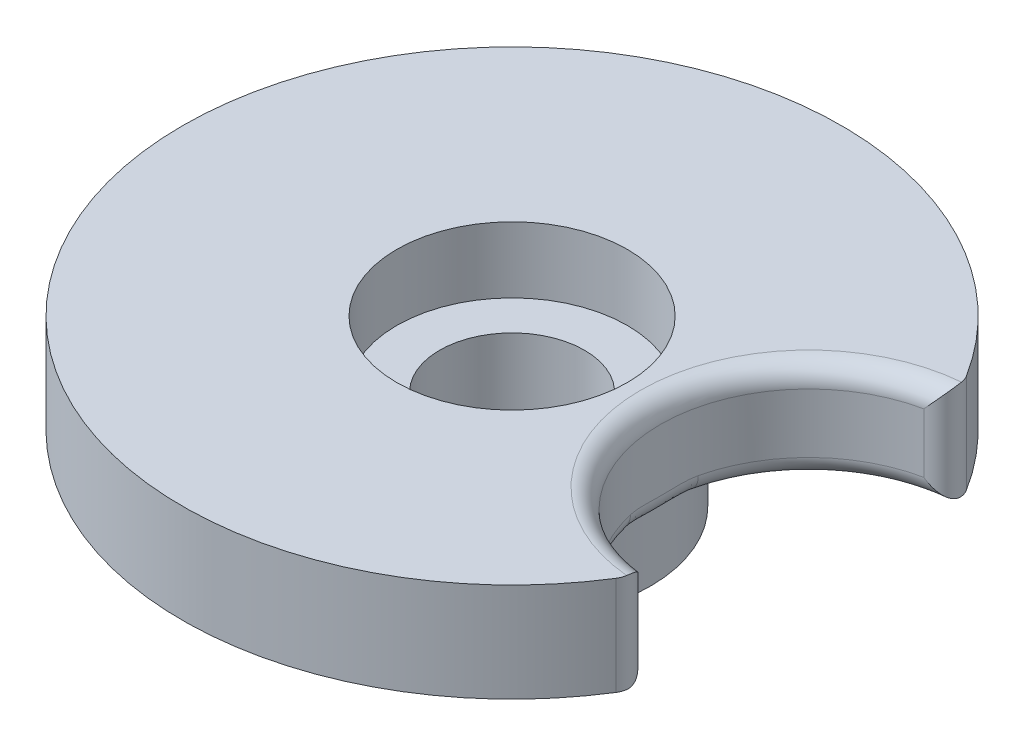
ISO-10303-21;
HEADER;
FILE_DESCRIPTION(('STEP AP214'),'2;1');
FILE_NAME('part.step','',(''),(''),'','','');
FILE_SCHEMA(('AUTOMOTIVE_DESIGN { 1 0 10303 214 1 1 1 1 }'));
ENDSEC;
DATA;
#1=APPLICATION_CONTEXT('core data for automotive mechanical design processes');
#2=APPLICATION_PROTOCOL_DEFINITION('international standard','automotive_design',2000,#1);
#3=PRODUCT_CONTEXT('',#1,'mechanical');
#4=PRODUCT('Part','Part','',(#3));
#5=PRODUCT_RELATED_PRODUCT_CATEGORY('part','',(#4));
#6=PRODUCT_DEFINITION_FORMATION('','',#4);
#7=PRODUCT_DEFINITION_CONTEXT('part definition',#1,'design');
#8=PRODUCT_DEFINITION('design','',#6,#7);
#9=PRODUCT_DEFINITION_SHAPE('','',#8);
#10=(LENGTH_UNIT() NAMED_UNIT(*) SI_UNIT(.MILLI.,.METRE.));
#11=(NAMED_UNIT(*) PLANE_ANGLE_UNIT() SI_UNIT($,.RADIAN.));
#12=(NAMED_UNIT(*) SI_UNIT($,.STERADIAN.) SOLID_ANGLE_UNIT());
#13=UNCERTAINTY_MEASURE_WITH_UNIT(LENGTH_MEASURE(1.E-05),#10,'distance_accuracy_value','');
#14=(GEOMETRIC_REPRESENTATION_CONTEXT(3) GLOBAL_UNCERTAINTY_ASSIGNED_CONTEXT((#13)) GLOBAL_UNIT_ASSIGNED_CONTEXT((#10,
#11,#12)) REPRESENTATION_CONTEXT('',''));
#15=CARTESIAN_POINT('',(0.,0.,0.));
#16=DIRECTION('',(0.,0.,1.));
#17=DIRECTION('',(1.,0.,0.));
#18=AXIS2_PLACEMENT_3D('',#15,#16,#17);
#19=CARTESIAN_POINT('',(0.,0.,0.));
#20=DIRECTION('',(0.,1.,0.));
#21=DIRECTION('',(0.,0.,1.));
#22=AXIS2_PLACEMENT_3D('',#19,#20,#21);
#23=PLANE('',#22);
#24=CARTESIAN_POINT('',(0.,0.,0.));
#25=DIRECTION('',(0.,1.,0.));
#26=DIRECTION('',(0.,0.,1.));
#27=AXIS2_PLACEMENT_3D('',#24,#25,#26);
#28=CIRCLE('',#27,5.334);
#29=CARTESIAN_POINT('',(5.12445,0.,1.48039460871081));
#30=VERTEX_POINT('',#29);
#31=CARTESIAN_POINT('',(5.12445,0.,-1.48039460871081));
#32=VERTEX_POINT('',#31);
#33=EDGE_CURVE('E143',#30,#32,#28,.F.);
#34=ORIENTED_EDGE('',*,*,#33,.F.);
#35=CARTESIAN_POINT('',(11.43,0.,0.));
#36=DIRECTION('',(0.,1.,0.));
#37=DIRECTION('',(0.,0.,1.));
#38=AXIS2_PLACEMENT_3D('',#35,#36,#37);
#39=CIRCLE('',#38,6.477);
#40=CARTESIAN_POINT('',(10.8680622925585,0.,6.45257739302331));
#41=VERTEX_POINT('',#40);
#42=EDGE_CURVE('E148',#30,#41,#39,.T.);
#43=ORIENTED_EDGE('',*,*,#42,.T.);
#44=CARTESIAN_POINT('',(10.1141388888889,0.,6.34192703649809));
#45=DIRECTION('',(0.,1.,0.));
#46=DIRECTION('',(0.,0.,1.));
#47=AXIS2_PLACEMENT_3D('',#44,#45,#46);
#48=CIRCLE('',#47,0.762);
#49=CARTESIAN_POINT('',(10.7597222222222,0.,6.74673088989158));
#50=VERTEX_POINT('',#49);
#51=EDGE_CURVE('E130',#41,#50,#48,.F.);
#52=ORIENTED_EDGE('',*,*,#51,.T.);
#53=CARTESIAN_POINT('',(0.,0.,0.));
#54=DIRECTION('',(0.,1.,0.));
#55=DIRECTION('',(0.,0.,1.));
#56=AXIS2_PLACEMENT_3D('',#53,#54,#55);
#57=CIRCLE('',#56,12.7);
#58=CARTESIAN_POINT('',(10.7597222222222,0.,-6.74673088989158));
#59=VERTEX_POINT('',#58);
#60=EDGE_CURVE('E118',#59,#50,#57,.T.);
#61=ORIENTED_EDGE('',*,*,#60,.F.);
#62=CARTESIAN_POINT('',(10.1141388888889,0.,-6.34192703649809));
#63=DIRECTION('',(0.,1.,0.));
#64=DIRECTION('',(0.,0.,1.));
#65=AXIS2_PLACEMENT_3D('',#62,#63,#64);
#66=CIRCLE('',#65,0.762);
#67=CARTESIAN_POINT('',(10.8680622925585,0.,-6.45257739302331));
#68=VERTEX_POINT('',#67);
#69=EDGE_CURVE('E127',#59,#68,#66,.F.);
#70=ORIENTED_EDGE('',*,*,#69,.T.);
#71=CARTESIAN_POINT('',(11.43,0.,0.));
#72=DIRECTION('',(0.,1.,0.));
#73=DIRECTION('',(0.,0.,1.));
#74=AXIS2_PLACEMENT_3D('',#71,#72,#73);
#75=CIRCLE('',#74,6.477);
#76=EDGE_CURVE('E138',#68,#32,#75,.T.);
#77=ORIENTED_EDGE('',*,*,#76,.T.);
#78=EDGE_LOOP('',(#34,#43,#52,#61,#70,#77));
#79=FACE_BOUND('',#78,.T.);
#80=ADVANCED_FACE('F43',(#79),#23,.F.);
#81=CARTESIAN_POINT('',(0.,3.81,0.));
#82=DIRECTION('',(0.,-1.,0.));
#83=DIRECTION('',(0.,0.,-1.));
#84=AXIS2_PLACEMENT_3D('',#81,#82,#83);
#85=CYLINDRICAL_SURFACE('',#84,2.794);
#86=CARTESIAN_POINT('',(0.,1.27,0.));
#87=DIRECTION('',(0.,1.,0.));
#88=DIRECTION('',(0.,0.,1.));
#89=AXIS2_PLACEMENT_3D('',#86,#87,#88);
#90=CIRCLE('',#89,2.794);
#91=CARTESIAN_POINT('',(0.,1.27,-2.794));
#92=VERTEX_POINT('',#91);
#93=EDGE_CURVE('E131',#92,#92,#90,.T.);
#94=CARTESIAN_POINT('',(0.,-2.54,0.));
#95=DIRECTION('',(0.,-1.,0.));
#96=DIRECTION('',(0.,0.,-1.));
#97=AXIS2_PLACEMENT_3D('',#94,#95,#96);
#98=CIRCLE('',#97,2.794);
#99=CARTESIAN_POINT('',(0.,-2.54,-2.794));
#100=VERTEX_POINT('',#99);
#101=EDGE_CURVE('E230',#100,#100,#98,.T.);
#102=CARTESIAN_POINT('',(0.,1.27,-2.794));
#103=CARTESIAN_POINT('',(0.,1.2303125,-2.794));
#104=CARTESIAN_POINT('',(0.,1.190625,-2.794));
#105=CARTESIAN_POINT('',(0.,1.11125,-2.794));
#106=CARTESIAN_POINT('',(0.,1.0715625,-2.794));
#107=CARTESIAN_POINT('',(0.,0.992187499999999,-2.794));
#108=CARTESIAN_POINT('',(0.,0.952499999999999,-2.794));
#109=CARTESIAN_POINT('',(0.,0.873124999999999,-2.794));
#110=CARTESIAN_POINT('',(0.,0.833437499999999,-2.794));
#111=CARTESIAN_POINT('',(0.,0.754062499999999,-2.794));
#112=CARTESIAN_POINT('',(0.,0.714374999999999,-2.794));
#113=CARTESIAN_POINT('',(0.,0.635,-2.794));
#114=CARTESIAN_POINT('',(0.,0.5953125,-2.794));
#115=CARTESIAN_POINT('',(0.,0.5159375,-2.794));
#116=CARTESIAN_POINT('',(0.,0.47625,-2.794));
#117=CARTESIAN_POINT('',(0.,0.396875,-2.794));
#118=CARTESIAN_POINT('',(0.,0.3571875,-2.794));
#119=CARTESIAN_POINT('',(0.,0.2778125,-2.794));
#120=CARTESIAN_POINT('',(0.,0.238125,-2.794));
#121=CARTESIAN_POINT('',(0.,0.15875,-2.794));
#122=CARTESIAN_POINT('',(0.,0.1190625,-2.794));
#123=CARTESIAN_POINT('',(0.,0.0396874999999996,-2.794));
#124=CARTESIAN_POINT('',(0.,0.,-2.794));
#125=CARTESIAN_POINT('',(0.,-0.079375,-2.794));
#126=CARTESIAN_POINT('',(0.,-0.1190625,-2.794));
#127=CARTESIAN_POINT('',(0.,-0.1984375,-2.794));
#128=CARTESIAN_POINT('',(0.,-0.238125,-2.794));
#129=CARTESIAN_POINT('',(0.,-0.3175,-2.794));
#130=CARTESIAN_POINT('',(0.,-0.3571875,-2.794));
#131=CARTESIAN_POINT('',(0.,-0.4365625,-2.794));
#132=CARTESIAN_POINT('',(0.,-0.47625,-2.794));
#133=CARTESIAN_POINT('',(0.,-0.555625,-2.794));
#134=CARTESIAN_POINT('',(0.,-0.5953125,-2.794));
#135=CARTESIAN_POINT('',(0.,-0.6746875,-2.794));
#136=CARTESIAN_POINT('',(0.,-0.714375,-2.794));
#137=CARTESIAN_POINT('',(0.,-0.79375,-2.794));
#138=CARTESIAN_POINT('',(0.,-0.833437499999999,-2.794));
#139=CARTESIAN_POINT('',(0.,-0.912812499999999,-2.794));
#140=CARTESIAN_POINT('',(0.,-0.952499999999999,-2.794));
#141=CARTESIAN_POINT('',(0.,-1.031875,-2.794));
#142=CARTESIAN_POINT('',(0.,-1.0715625,-2.794));
#143=CARTESIAN_POINT('',(0.,-1.1509375,-2.794));
#144=CARTESIAN_POINT('',(0.,-1.190625,-2.794));
#145=CARTESIAN_POINT('',(0.,-1.27,-2.794));
#146=CARTESIAN_POINT('',(0.,-1.3096875,-2.794));
#147=CARTESIAN_POINT('',(0.,-1.3890625,-2.794));
#148=CARTESIAN_POINT('',(0.,-1.42875,-2.794));
#149=CARTESIAN_POINT('',(0.,-1.508125,-2.794));
#150=CARTESIAN_POINT('',(0.,-1.5478125,-2.794));
#151=CARTESIAN_POINT('',(0.,-1.6271875,-2.794));
#152=CARTESIAN_POINT('',(0.,-1.666875,-2.794));
#153=CARTESIAN_POINT('',(0.,-1.74625,-2.794));
#154=CARTESIAN_POINT('',(0.,-1.7859375,-2.794));
#155=CARTESIAN_POINT('',(0.,-1.8653125,-2.794));
#156=CARTESIAN_POINT('',(0.,-1.905,-2.794));
#157=CARTESIAN_POINT('',(0.,-1.984375,-2.794));
#158=CARTESIAN_POINT('',(0.,-2.0240625,-2.794));
#159=CARTESIAN_POINT('',(0.,-2.1034375,-2.794));
#160=CARTESIAN_POINT('',(0.,-2.143125,-2.794));
#161=CARTESIAN_POINT('',(0.,-2.2225,-2.794));
#162=CARTESIAN_POINT('',(0.,-2.2621875,-2.794));
#163=CARTESIAN_POINT('',(0.,-2.3415625,-2.794));
#164=CARTESIAN_POINT('',(0.,-2.38125,-2.794));
#165=CARTESIAN_POINT('',(0.,-2.460625,-2.794));
#166=CARTESIAN_POINT('',(0.,-2.5003125,-2.794));
#167=CARTESIAN_POINT('',(0.,-2.54,-2.794));
#168=B_SPLINE_CURVE_WITH_KNOTS('',3,(#102,#103,#104,#105,#106,#107,#108,#109,#110,#111,#112,
#113,#114,#115,#116,#117,#118,#119,#120,#121,#122,#123,#124,#125,#126,#127,#128,#129,#130,#131,
#132,#133,#134,#135,#136,#137,#138,#139,#140,#141,#142,#143,#144,#145,#146,#147,#148,#149,#150,
#151,#152,#153,#154,#155,#156,#157,#158,#159,#160,#161,#162,#163,#164,#165,#166,#167),
.UNSPECIFIED.,.F.,.F.,(4,2,2,2,2,2,2,2,2,2,2,2,2,2,2,2,2,2,2,2,2,2,2,2,2,2,2,2,2,2,2,2,4),(0.,
0.1190625,0.238125,0.3571875,0.47625,0.5953125,0.714375,0.8334375,0.9525,1.0715625,1.190625,
1.3096875,1.42875,1.5478125,1.666875,1.7859375,1.905,2.0240625,2.143125,2.2621875,2.38125,
2.5003125,2.619375,2.7384375,2.8575,2.9765625,3.095625,3.2146875,3.33375,3.4528125,3.571875,
3.6909375,3.81),.UNSPECIFIED.);
#169=EDGE_CURVE('BSEAM175',#92,#100,#168,.T.);
#170=ORIENTED_EDGE('',*,*,#93,.T.);
#171=ORIENTED_EDGE('',*,*,#101,.T.);
#172=ORIENTED_EDGE('',*,*,#169,.T.);
#173=ORIENTED_EDGE('',*,*,#169,.F.);
#174=EDGE_LOOP('',(#170,#172,#171,#173));
#175=FACE_BOUND('',#174,.T.);
#176=ADVANCED_FACE('F175',(#175),#85,.F.);
#177=CARTESIAN_POINT('',(11.43,3.81,0.));
#178=DIRECTION('',(0.,-1.,0.));
#179=DIRECTION('',(0.,0.,-1.));
#180=AXIS2_PLACEMENT_3D('',#177,#178,#179);
#181=CYLINDRICAL_SURFACE('',#180,5.715);
#182=CARTESIAN_POINT('',(11.43,3.048,0.));
#183=DIRECTION('',(0.,1.,0.));
#184=DIRECTION('',(0.,0.,1.));
#185=AXIS2_PLACEMENT_3D('',#182,#183,#184);
#186=CIRCLE('',#185,5.715);
#187=CARTESIAN_POINT('',(10.2689460784314,3.048,-5.59581797338067));
#188=VERTEX_POINT('',#187);
#189=CARTESIAN_POINT('',(10.2689460784314,3.048,5.59581797338067));
#190=VERTEX_POINT('',#189);
#191=EDGE_CURVE('E152',#188,#190,#186,.T.);
#192=ORIENTED_EDGE('',*,*,#191,.T.);
#193=DIRECTION('',(0.,-1.,0.));
#194=VECTOR('',#193,1.);
#195=CARTESIAN_POINT('',(10.2689460784314,3.81,5.59581797338067));
#196=LINE('',#195,#194);
#197=CARTESIAN_POINT('',(10.2689460784314,0.762,5.59581797338067));
#198=VERTEX_POINT('',#197);
#199=EDGE_CURVE('E302',#190,#198,#196,.T.);
#200=ORIENTED_EDGE('',*,*,#199,.T.);
#201=CARTESIAN_POINT('',(11.43,0.762,0.));
#202=DIRECTION('',(0.,1.,0.));
#203=DIRECTION('',(0.,0.,1.));
#204=AXIS2_PLACEMENT_3D('',#201,#202,#203);
#205=CIRCLE('',#204,5.715);
#206=CARTESIAN_POINT('',(5.86627941176471,0.762,1.30623053709777));
#207=VERTEX_POINT('',#206);
#208=EDGE_CURVE('E165',#198,#207,#205,.F.);
#209=ORIENTED_EDGE('',*,*,#208,.T.);
#210=CARTESIAN_POINT('',(4.97312932361178,0.,1.9286110884864));
#211=CARTESIAN_POINT('',(5.90626931370417,-0.350933542346347,1.50151047856429));
#212=CARTESIAN_POINT('',(6.00878053023959,0.684155879532089,1.80875771199204));
#213=CARTESIAN_POINT('',(4.9847789847079,0.,1.89857649977635));
#214=CARTESIAN_POINT('',(5.91005417842956,-0.319323497965891,1.50597368577232));
#215=CARTESIAN_POINT('',(5.996352635268,0.69805920679994,1.77152438108922));
#216=CARTESIAN_POINT('',(4.99660185674631,0.,1.8672775595917));
#217=CARTESIAN_POINT('',(5.91141897170561,-0.287192793203552,1.50449550486489));
#218=CARTESIAN_POINT('',(5.98414104113483,0.709682139082069,1.73363014859137));
#219=CARTESIAN_POINT('',(5.02035564559981,0.,1.8024344756223));
#220=CARTESIAN_POINT('',(5.91035821408699,-0.225111751630629,1.49127619285138));
#221=CARTESIAN_POINT('',(5.9603288261235,0.728989334850308,1.65696006313178));
#222=CARTESIAN_POINT('',(5.03228629202622,0.,1.76889505407424));
#223=CARTESIAN_POINT('',(5.90806907315657,-0.195064447945032,1.4799013599901));
#224=CARTESIAN_POINT('',(5.9487270068973,0.736681604146657,1.61818617151587));
#225=CARTESIAN_POINT('',(5.06771387296069,0.,1.66585392712198));
#226=CARTESIAN_POINT('',(5.89765386826964,-0.11212880563409,1.4346312062855));
#227=CARTESIAN_POINT('',(5.91525696804073,0.754737177496196,1.50176784507197));
#228=CARTESIAN_POINT('',(5.09109269222122,0.,1.59330755670933));
#229=CARTESIAN_POINT('',(5.88610067297421,-0.0622571290537975,1.3894936845881));
#230=CARTESIAN_POINT('',(5.89446466407265,0.760335810872677,1.42325265373925));
#231=CARTESIAN_POINT('',(5.15080648517527,0.,1.39204804712174));
#232=CARTESIAN_POINT('',(5.85209648998748,0.046163287572243,1.24697981576654));
#233=CARTESIAN_POINT('',(5.84387511939853,0.763900908801913,1.2142405231681));
#234=CARTESIAN_POINT('',(5.18570544054233,0.,1.25743355533015));
#235=CARTESIAN_POINT('',(5.82669346611129,0.096245834628168,1.13272875309061));
#236=CARTESIAN_POINT('',(5.81698870493245,0.754558190498439,1.08307058548534));
#237=CARTESIAN_POINT('',(5.24656877284377,0.,0.972785914373179));
#238=CARTESIAN_POINT('',(5.78196582695775,0.164549043917826,0.883126763978383));
#239=CARTESIAN_POINT('',(5.77248429415282,0.727913603000161,0.819591201092678));
#240=CARTESIAN_POINT('',(5.27250108286735,0.,0.822699868262716));
#241=CARTESIAN_POINT('',(5.76184624816401,0.18518970334727,0.746278284993455));
#242=CARTESIAN_POINT('',(5.75489944616785,0.710583674490279,0.687279364263295));
#243=CARTESIAN_POINT('',(5.30199365529775,0.,0.588790342909651));
#244=CARTESIAN_POINT('',(5.739279297088,0.204401705158946,0.532960246946762));
#245=CARTESIAN_POINT('',(5.73542375731603,0.688110702915533,0.48736771593987));
#246=CARTESIAN_POINT('',(5.31026796538854,0.,0.509091026038854));
#247=CARTESIAN_POINT('',(5.732976887203,0.208926394458547,0.460617961240117));
#248=CARTESIAN_POINT('',(5.73007626783983,0.681190457389328,0.420275396018857));
#249=CARTESIAN_POINT('',(5.32326769728295,0.,0.34773060892914));
#250=CARTESIAN_POINT('',(5.72313844937425,0.215440272270336,0.314638590119346));
#251=CARTESIAN_POINT('',(5.72175162795173,0.669899821115572,0.285776471622895));
#252=CARTESIAN_POINT('',(5.32799365206853,0.,0.266069805218442));
#253=CARTESIAN_POINT('',(5.71954276745205,0.217476631316887,0.240578009608725));
#254=CARTESIAN_POINT('',(5.71877412155164,0.665529047445708,0.218369915878938));
#255=CARTESIAN_POINT('',(5.33365349930074,0.,0.102038972708985));
#256=CARTESIAN_POINT('',(5.71526547463308,0.219853079279034,0.0923424016776295));
#257=CARTESIAN_POINT('',(5.7152141126061,0.660258052786789,0.0835492273919337));
#258=CARTESIAN_POINT('',(5.3345968673036,0.,0.019671234751854));
#259=CARTESIAN_POINT('',(5.7145500769063,0.220212488246374,0.0177142036209617));
#260=CARTESIAN_POINT('',(5.71462562541001,0.659349159911604,0.0161355371657831));
#261=CARTESIAN_POINT('',(5.33266981758441,0.,-0.144753103248381));
#262=CARTESIAN_POINT('',(5.71600478753211,0.219432984990682,-0.130826631941493));
#263=CARTESIAN_POINT('',(5.71583393425697,0.661166715962217,-0.1186310145097));
#264=CARTESIAN_POINT('',(5.32979926598014,0.,-0.226809692267641));
#265=CARTESIAN_POINT('',(5.71818407023952,0.218289233789526,-0.20520050069412));
#266=CARTESIAN_POINT('',(5.71763081403493,0.663893292506001,-0.185983873740592));
#267=CARTESIAN_POINT('',(5.31887767929593,0.,-0.415512113441502));
#268=CARTESIAN_POINT('',(5.72645775428512,0.213344651078122,-0.376038842474624));
#269=CARTESIAN_POINT('',(5.72454857679884,0.6737909171421,-0.341972803878157));
#270=CARTESIAN_POINT('',(5.30946096489381,0.,-0.521608262892942));
#271=CARTESIAN_POINT('',(5.73366104995633,0.208757730980408,-0.472554829909835));
#272=CARTESIAN_POINT('',(5.73055035572212,0.682106503702802,-0.430510342834191));
#273=CARTESIAN_POINT('',(5.2849450803403,0.,-0.729305259139489));
#274=CARTESIAN_POINT('',(5.75224301846843,0.193650306034922,-0.660435787011771));
#275=CARTESIAN_POINT('',(5.74664302869755,0.701306760923752,-0.607089575953444));
#276=CARTESIAN_POINT('',(5.26983788845558,0.,-0.830899532726893));
#277=CARTESIAN_POINT('',(5.7638150885625,0.182913981703445,-0.752663194214202));
#278=CARTESIAN_POINT('',(5.75673969676792,0.712195050149086,-0.695130391235712));
#279=CARTESIAN_POINT('',(5.23501893542937,0.,-1.02765026369169));
#280=CARTESIAN_POINT('',(5.78997180729997,0.1520419151337,-0.92885998228231));
#281=CARTESIAN_POINT('',(5.78097195014758,0.732843983453477,-0.870336529071702));
#282=CARTESIAN_POINT('',(5.21532979456741,0.,-1.12283547753791));
#283=CARTESIAN_POINT('',(5.80477661759138,0.131482040230213,-1.01350976875077));
#284=CARTESIAN_POINT('',(5.79508776775704,0.742609826024568,-0.957504026503196));
#285=CARTESIAN_POINT('',(5.17245670995689,0.,-1.30617986553121));
#286=CARTESIAN_POINT('',(5.83548495764305,0.0771752422005618,-1.17076727804601));
#287=CARTESIAN_POINT('',(5.82740446210109,0.757148752246357,-1.13135191014242));
#288=CARTESIAN_POINT('',(5.1492766182628,0.,-1.39434662221783));
#289=CARTESIAN_POINT('',(5.85158730844326,0.0425757520049548,-1.24360596792822));
#290=CARTESIAN_POINT('',(5.84560084686563,0.761927293559597,-1.21803272535801));
#291=CARTESIAN_POINT('',(5.10076177253796,0.,-1.56249918858125));
#292=CARTESIAN_POINT('',(5.88110829422954,-0.0429696352215042,-1.36943881797489));
#293=CARTESIAN_POINT('',(5.88600957652966,0.762070965703208,-1.39038551230692));
#294=CARTESIAN_POINT('',(5.07543348316781,0.,-1.6425080525218));
#295=CARTESIAN_POINT('',(5.89451247419599,-0.0952325235212285,-1.42189789159063));
#296=CARTESIAN_POINT('',(5.90821008395344,0.75746344213179,-1.47605968537884));
#297=CARTESIAN_POINT('',(5.03683846650289,0.,-1.75597607372792));
#298=CARTESIAN_POINT('',(5.9070468098521,-0.183883941120261,-1.4751230232262));
#299=CARTESIAN_POINT('',(5.94433826292533,0.739432236252914,-1.60334998874919));
#300=CARTESIAN_POINT('',(5.0237654596974,0.,-1.79297807113679));
#301=CARTESIAN_POINT('',(5.90993669040624,-0.21648867940151,-1.48866982042036));
#302=CARTESIAN_POINT('',(5.95696545340737,0.731458244249589,-1.64591361163012));
#303=CARTESIAN_POINT('',(4.99771983281367,0.,-1.86435108777148));
#304=CARTESIAN_POINT('',(5.91160972486146,-0.284214077008853,-1.50454309869346));
#305=CARTESIAN_POINT('',(5.98297345726259,0.710844499547355,-1.73005527820744));
#306=CARTESIAN_POINT('',(4.98474765728702,0.,-1.89871347395642));
#307=CARTESIAN_POINT('',(5.91021473022655,-0.319469117783278,-1.5063869955185));
#308=CARTESIAN_POINT('',(5.99635651414792,0.698190163786199,-1.77162980448614));
#309=CARTESIAN_POINT('',(4.97198594391343,0.,-1.93155682637795));
#310=CARTESIAN_POINT('',(5.90588383470463,-0.354084084324578,-1.50105014878935));
#311=CARTESIAN_POINT('',(6.01000081353106,0.68278179503807,-1.81241105124529));
#312=(BOUNDED_SURFACE() B_SPLINE_SURFACE(3,2,((#210,#211,#212),(#213,#214,#215),(#216,#217,
#218),(#219,#220,#221),(#222,#223,#224),(#225,#226,#227),(#228,#229,#230),(#231,#232,#233),
(#234,#235,#236),(#237,#238,#239),(#240,#241,#242),(#243,#244,#245),(#246,#247,#248),(#249,#250,
#251),(#252,#253,#254),(#255,#256,#257),(#258,#259,#260),(#261,#262,#263),(#264,#265,#266),
(#267,#268,#269),(#270,#271,#272),(#273,#274,#275),(#276,#277,#278),(#279,#280,#281),(#282,#283,
#284),(#285,#286,#287),(#288,#289,#290),(#291,#292,#293),(#294,#295,#296),(#297,#298,#299),
(#300,#301,#302),(#303,#304,#305),(#306,#307,#308),(#309,#310,#311)),.UNSPECIFIED.,.F.,.F.,
.F.) B_SPLINE_SURFACE_WITH_KNOTS((4,2,2,2,2,2,2,2,2,2,2,2,2,2,2,2,4),(3,3),(0.,0.13964960747144,
0.279013637239881,0.554894066847469,1.00977932924439,1.4662749431092,1.69598005141461,
1.92565064987622,2.15474555198385,2.383848496354,2.6863925248256,2.98936464843395,
3.29087164526309,3.59204835237722,3.89234885865086,4.04497295023274,4.19807665161022),(0.,1.),
.UNSPECIFIED.) GEOMETRIC_REPRESENTATION_ITEM() RATIONAL_B_SPLINE_SURFACE(((1.,0.574875233249254,
1.),(1.,0.58577284676393,1.),(1.,0.596640938048075,1.),(1.,0.618123511106623,1.),(1.,
0.628738466053241,1.),(1.,0.659767250655454,1.),(1.,0.679594138963735,1.),(1.,0.728914890546049,
1.),(1.,0.756333935903969,1.),(1.,0.802831965083889,1.),(1.,0.821881080402165,1.),(1.,
0.843246329711739,1.),(1.,0.849173875352429,1.),(1.,0.858442665324583,1.),(1.,0.861784298076325,
1.),(1.,0.865782844992386,1.),(1.,0.866446467723529,1.),(1.,0.865087251195992,1.),(1.,
0.863064317629583,1.),(1.,0.855320787696955,1.),(1.,0.848622744226639,1.),(1.,0.830918065361927,
1.),(1.,0.819905346787071,1.),(1.,0.793985060565824,1.),(1.,0.779096585349901,1.),(1.,
0.745815994183848,1.),(1.,0.727427734208742,1.),(1.,0.687717724727812,1.),(1.,0.666404665135066,
1.),(1.,0.632769763429999,1.),(1.,0.621180518023447,1.),(1.,0.597674930351724,1.),(1.,
0.585757674651033,1.),(1.,0.573805460888062,1.))) REPRESENTATION_ITEM('') SURFACE());
#313=CARTESIAN_POINT('',(6.00878053023959,0.684155879532089,1.80875771199204));
#314=CARTESIAN_POINT('',(5.996352635268,0.69805920679994,1.77152438108922));
#315=CARTESIAN_POINT('',(5.98414104113483,0.709682139082069,1.73363014859137));
#316=CARTESIAN_POINT('',(5.9603288261235,0.728989334850308,1.65696006313178));
#317=CARTESIAN_POINT('',(5.9487270068973,0.736681604146657,1.61818617151587));
#318=CARTESIAN_POINT('',(5.91525696804073,0.754737177496196,1.50176784507197));
#319=CARTESIAN_POINT('',(5.89446466407265,0.760335810872677,1.42325265373925));
#320=CARTESIAN_POINT('',(5.84387511939853,0.763900908801913,1.2142405231681));
#321=CARTESIAN_POINT('',(5.81698870493245,0.754558190498439,1.08307058548534));
#322=CARTESIAN_POINT('',(5.77248429415282,0.727913603000161,0.819591201092678));
#323=CARTESIAN_POINT('',(5.75489944616785,0.710583674490279,0.687279364263295));
#324=CARTESIAN_POINT('',(5.73542375731603,0.688110702915533,0.48736771593987));
#325=CARTESIAN_POINT('',(5.73007626783983,0.681190457389328,0.420275396018857));
#326=CARTESIAN_POINT('',(5.72175162795173,0.669899821115572,0.285776471622895));
#327=CARTESIAN_POINT('',(5.71877412155164,0.665529047445708,0.218369915878938));
#328=CARTESIAN_POINT('',(5.7152141126061,0.660258052786789,0.0835492273919337));
#329=CARTESIAN_POINT('',(5.71462562541001,0.659349159911604,0.0161355371657832));
#330=CARTESIAN_POINT('',(5.71583393425697,0.661166715962217,-0.1186310145097));
#331=CARTESIAN_POINT('',(5.71763081403493,0.663893292506001,-0.185983873740592));
#332=CARTESIAN_POINT('',(5.72454857679884,0.6737909171421,-0.341972803878157));
#333=CARTESIAN_POINT('',(5.73055035572212,0.682106503702802,-0.430510342834191));
#334=CARTESIAN_POINT('',(5.74664302869755,0.701306760923752,-0.607089575953444));
#335=CARTESIAN_POINT('',(5.75673969676792,0.712195050149086,-0.695130391235712));
#336=CARTESIAN_POINT('',(5.78097195014758,0.732843983453477,-0.870336529071702));
#337=CARTESIAN_POINT('',(5.79508776775704,0.742609826024567,-0.957504026503196));
#338=CARTESIAN_POINT('',(5.82740446210109,0.757148752246357,-1.13135191014242));
#339=CARTESIAN_POINT('',(5.84560084686563,0.761927293559597,-1.21803272535801));
#340=CARTESIAN_POINT('',(5.88600957652965,0.762070965703208,-1.39038551230692));
#341=CARTESIAN_POINT('',(5.90821008395344,0.75746344213179,-1.47605968537883));
#342=CARTESIAN_POINT('',(5.94433826292533,0.739432236252914,-1.60334998874919));
#343=CARTESIAN_POINT('',(5.95696545340737,0.731458244249589,-1.64591361163012));
#344=CARTESIAN_POINT('',(5.9829734572626,0.710844499547355,-1.73005527820744));
#345=CARTESIAN_POINT('',(5.99635651414792,0.698190163786199,-1.77162980448614));
#346=CARTESIAN_POINT('',(6.01000081353106,0.68278179503807,-1.81241105124529));
#347=B_SPLINE_CURVE_WITH_KNOTS('',3,(#313,#314,#315,#316,#317,#318,#319,#320,#321,#322,#323,
#324,#325,#326,#327,#328,#329,#330,#331,#332,#333,#334,#335,#336,#337,#338,#339,#340,#341,#342,
#343,#344,#345,#346),.UNSPECIFIED.,.F.,.F.,(4,2,2,2,2,2,2,2,2,2,2,2,2,2,2,2,4),(0.,
0.13964960747144,0.279013637239881,0.554894066847469,1.00977932924439,1.4662749431092,
1.69598005141461,1.92565064987622,2.15474555198385,2.383848496354,2.6863925248256,
2.98936464843395,3.29087164526309,3.59204835237722,3.89234885865086,4.04497295023274,
4.19807665161022),.UNSPECIFIED.);
#348=CARTESIAN_POINT('',(5.86627941176471,0.762,-1.30623053709777));
#349=VERTEX_POINT('',#348);
#350=EDGE_CURVE('E157',#207,#349,#347,.T.);
#351=ORIENTED_EDGE('',*,*,#350,.T.);
#352=CARTESIAN_POINT('',(11.43,0.762,0.));
#353=DIRECTION('',(0.,1.,0.));
#354=DIRECTION('',(0.,0.,1.));
#355=AXIS2_PLACEMENT_3D('',#352,#353,#354);
#356=CIRCLE('',#355,5.715);
#357=CARTESIAN_POINT('',(10.2689460784314,0.762,-5.59581797338067));
#358=VERTEX_POINT('',#357);
#359=EDGE_CURVE('E154',#349,#358,#356,.F.);
#360=ORIENTED_EDGE('',*,*,#359,.T.);
#361=DIRECTION('',(0.,-1.,0.));
#362=VECTOR('',#361,1.);
#363=CARTESIAN_POINT('',(10.2689460784314,3.81,-5.59581797338067));
#364=LINE('',#363,#362);
#365=EDGE_CURVE('E150',#358,#188,#364,.F.);
#366=ORIENTED_EDGE('',*,*,#365,.T.);
#367=EDGE_LOOP('',(#192,#200,#209,#351,#360,#366));
#368=FACE_BOUND('',#367,.T.);
#369=ADVANCED_FACE('F171',(#368),#181,.F.);
#370=CARTESIAN_POINT('',(0.,3.81,0.));
#371=DIRECTION('',(0.,-1.,0.));
#372=DIRECTION('',(0.,0.,-1.));
#373=AXIS2_PLACEMENT_3D('',#370,#371,#372);
#374=CYLINDRICAL_SURFACE('',#373,12.7);
#375=ORIENTED_EDGE('',*,*,#60,.T.);
#376=DIRECTION('',(0.,-1.,0.));
#377=VECTOR('',#376,1.);
#378=CARTESIAN_POINT('',(10.7597222222222,3.81,6.74673088989158));
#379=LINE('',#378,#377);
#380=CARTESIAN_POINT('',(10.7597222222222,3.81,6.74673088989158));
#381=VERTEX_POINT('',#380);
#382=EDGE_CURVE('E11',#50,#381,#379,.F.);
#383=ORIENTED_EDGE('',*,*,#382,.T.);
#384=CARTESIAN_POINT('',(0.,3.81,0.));
#385=DIRECTION('',(0.,1.,0.));
#386=DIRECTION('',(0.,0.,1.));
#387=AXIS2_PLACEMENT_3D('',#384,#385,#386);
#388=CIRCLE('',#387,12.7);
#389=CARTESIAN_POINT('',(10.7597222222222,3.81,-6.74673088989158));
#390=VERTEX_POINT('',#389);
#391=EDGE_CURVE('E120',#390,#381,#388,.T.);
#392=ORIENTED_EDGE('',*,*,#391,.F.);
#393=DIRECTION('',(0.,-1.,0.));
#394=VECTOR('',#393,1.);
#395=CARTESIAN_POINT('',(10.7597222222222,3.81,-6.74673088989158));
#396=LINE('',#395,#394);
#397=EDGE_CURVE('E58',#390,#59,#396,.T.);
#398=ORIENTED_EDGE('',*,*,#397,.T.);
#399=EDGE_LOOP('',(#375,#383,#392,#398));
#400=FACE_BOUND('',#399,.T.);
#401=ADVANCED_FACE('F117',(#400),#374,.T.);
#402=CARTESIAN_POINT('',(0.,3.81,0.));
#403=DIRECTION('',(0.,1.,0.));
#404=DIRECTION('',(0.,0.,1.));
#405=AXIS2_PLACEMENT_3D('',#402,#403,#404);
#406=PLANE('',#405);
#407=CARTESIAN_POINT('',(0.,3.81,0.));
#408=DIRECTION('',(0.,1.,0.));
#409=DIRECTION('',(0.,0.,1.));
#410=AXIS2_PLACEMENT_3D('',#407,#408,#409);
#411=CIRCLE('',#410,4.445);
#412=CARTESIAN_POINT('',(0.,3.81,4.445));
#413=VERTEX_POINT('',#412);
#414=EDGE_CURVE('E283',#413,#413,#411,.T.);
#415=ORIENTED_EDGE('',*,*,#414,.F.);
#416=EDGE_LOOP('',(#415));
#417=FACE_BOUND('',#416,.T.);
#418=ORIENTED_EDGE('',*,*,#391,.T.);
#419=CARTESIAN_POINT('',(10.1141388888889,3.81,6.34192703649809));
#420=DIRECTION('',(0.,1.,0.));
#421=DIRECTION('',(0.,0.,1.));
#422=AXIS2_PLACEMENT_3D('',#419,#420,#421);
#423=CIRCLE('',#422,0.762);
#424=CARTESIAN_POINT('',(10.8680622925585,3.81,6.45257739302331));
#425=VERTEX_POINT('',#424);
#426=EDGE_CURVE('E66',#381,#425,#423,.T.);
#427=ORIENTED_EDGE('',*,*,#426,.T.);
#428=CARTESIAN_POINT('',(11.43,3.81,0.));
#429=DIRECTION('',(0.,1.,0.));
#430=DIRECTION('',(0.,0.,1.));
#431=AXIS2_PLACEMENT_3D('',#428,#429,#430);
#432=CIRCLE('',#431,6.477);
#433=CARTESIAN_POINT('',(10.8680622925585,3.81,-6.45257739302331));
#434=VERTEX_POINT('',#433);
#435=EDGE_CURVE('E71',#425,#434,#432,.F.);
#436=ORIENTED_EDGE('',*,*,#435,.T.);
#437=CARTESIAN_POINT('',(10.1141388888889,3.81,-6.34192703649809));
#438=DIRECTION('',(0.,1.,0.));
#439=DIRECTION('',(0.,0.,1.));
#440=AXIS2_PLACEMENT_3D('',#437,#438,#439);
#441=CIRCLE('',#440,0.762);
#442=EDGE_CURVE('E297',#434,#390,#441,.T.);
#443=ORIENTED_EDGE('',*,*,#442,.T.);
#444=EDGE_LOOP('',(#418,#427,#436,#443));
#445=FACE_BOUND('',#444,.T.);
#446=ADVANCED_FACE('F256',(#417,#445),#406,.T.);
#447=CARTESIAN_POINT('',(0.,1.27,0.));
#448=DIRECTION('',(0.,1.,0.));
#449=DIRECTION('',(0.,0.,1.));
#450=AXIS2_PLACEMENT_3D('',#447,#448,#449);
#451=CYLINDRICAL_SURFACE('',#450,4.445);
#452=CARTESIAN_POINT('',(0.,1.27,0.));
#453=DIRECTION('',(0.,1.,0.));
#454=DIRECTION('',(0.,0.,1.));
#455=AXIS2_PLACEMENT_3D('',#452,#453,#454);
#456=CIRCLE('',#455,4.445);
#457=CARTESIAN_POINT('',(0.,1.27,4.445));
#458=VERTEX_POINT('',#457);
#459=EDGE_CURVE('E286',#458,#458,#456,.T.);
#460=ORIENTED_EDGE('',*,*,#459,.F.);
#461=EDGE_LOOP('',(#460));
#462=FACE_BOUND('',#461,.T.);
#463=ORIENTED_EDGE('',*,*,#414,.T.);
#464=EDGE_LOOP('',(#463));
#465=FACE_BOUND('',#464,.T.);
#466=ADVANCED_FACE('F259',(#462,#465),#451,.F.);
#467=CARTESIAN_POINT('',(0.,1.27,0.));
#468=DIRECTION('',(0.,1.,0.));
#469=DIRECTION('',(0.,0.,1.));
#470=AXIS2_PLACEMENT_3D('',#467,#468,#469);
#471=PLANE('',#470);
#472=ORIENTED_EDGE('',*,*,#93,.F.);
#473=EDGE_LOOP('',(#472));
#474=FACE_BOUND('',#473,.T.);
#475=ORIENTED_EDGE('',*,*,#459,.T.);
#476=EDGE_LOOP('',(#475));
#477=FACE_BOUND('',#476,.T.);
#478=ADVANCED_FACE('F263',(#474,#477),#471,.T.);
#479=CARTESIAN_POINT('',(0.,-2.54,0.));
#480=DIRECTION('',(0.,-1.,0.));
#481=DIRECTION('',(0.,0.,-1.));
#482=AXIS2_PLACEMENT_3D('',#479,#480,#481);
#483=PLANE('',#482);
#484=CARTESIAN_POINT('',(0.,-2.54,0.));
#485=DIRECTION('',(0.,-1.,0.));
#486=DIRECTION('',(0.,0.,-1.));
#487=AXIS2_PLACEMENT_3D('',#484,#485,#486);
#488=CIRCLE('',#487,5.334);
#489=CARTESIAN_POINT('',(0.,-2.54,-5.334));
#490=VERTEX_POINT('',#489);
#491=EDGE_CURVE('E278',#490,#490,#488,.T.);
#492=ORIENTED_EDGE('',*,*,#491,.T.);
#493=EDGE_LOOP('',(#492));
#494=FACE_BOUND('',#493,.T.);
#495=ORIENTED_EDGE('',*,*,#101,.F.);
#496=EDGE_LOOP('',(#495));
#497=FACE_BOUND('',#496,.T.);
#498=ADVANCED_FACE('F266',(#494,#497),#483,.T.);
#499=CARTESIAN_POINT('',(0.,-2.54,0.));
#500=DIRECTION('',(0.,1.,0.));
#501=DIRECTION('',(0.,0.,1.));
#502=AXIS2_PLACEMENT_3D('',#499,#500,#501);
#503=CYLINDRICAL_SURFACE('',#502,5.334);
#504=ORIENTED_EDGE('',*,*,#491,.F.);
#505=EDGE_LOOP('',(#504));
#506=FACE_BOUND('',#505,.T.);
#507=EDGE_CURVE('E139',#32,#30,#28,.F.);
#508=ORIENTED_EDGE('',*,*,#507,.T.);
#509=ORIENTED_EDGE('',*,*,#33,.T.);
#510=EDGE_LOOP('',(#508,#509));
#511=FACE_BOUND('',#510,.T.);
#512=ADVANCED_FACE('F216',(#506,#511),#503,.T.);
#513=CARTESIAN_POINT('',(10.1141388888889,3.81,6.34192703649809));
#514=DIRECTION('',(0.,1.,0.));
#515=DIRECTION('',(0.,0.,1.));
#516=AXIS2_PLACEMENT_3D('',#513,#514,#515);
#517=CYLINDRICAL_SURFACE('',#516,0.762);
#518=CARTESIAN_POINT('',(10.8680622925585,0.,6.45257739302331));
#519=CARTESIAN_POINT('',(10.8705138828847,-2.15568426884695E-06,6.43588840699814));
#520=CARTESIAN_POINT('',(10.872405068121,0.000558713482718886,6.41912679202179));
#521=CARTESIAN_POINT('',(10.8750717760509,0.00279401471874972,6.38559993030784));
#522=CARTESIAN_POINT('',(10.8758480269498,0.00446771890744997,6.36883469310018));
#523=CARTESIAN_POINT('',(10.8765116967396,0.0110995967961849,6.31901989771664));
#524=CARTESIAN_POINT('',(10.8747786525659,0.0176691272231392,6.28613986375779));
#525=CARTESIAN_POINT('',(10.8673348024045,0.0346817069746472,6.2219941730261));
#526=CARTESIAN_POINT('',(10.8616326766593,0.045116280331487,6.19072515299083));
#527=CARTESIAN_POINT('',(10.8468231626006,0.0692720310756008,6.13029436557784));
#528=CARTESIAN_POINT('',(10.8377087213135,0.0829999943693045,6.10113711305956));
#529=CARTESIAN_POINT('',(10.812423171209,0.119200594843903,6.03403431356145));
#530=CARTESIAN_POINT('',(10.7948888911966,0.142964701337875,5.99730197463385));
#531=CARTESIAN_POINT('',(10.7557542677812,0.194225901687795,5.92897317615827));
#532=CARTESIAN_POINT('',(10.734145199035,0.221730970170352,5.8973880139375));
#533=CARTESIAN_POINT('',(10.6777848486331,0.292022163701857,5.82635529978929));
#534=CARTESIAN_POINT('',(10.641435931065,0.33620481230803,5.7895680070907));
#535=CARTESIAN_POINT('',(10.5646962138672,0.42766850649039,5.72536483419552));
#536=CARTESIAN_POINT('',(10.5243009591246,0.474952947006164,5.69795943359418));
#537=CARTESIAN_POINT('',(10.4490444274392,0.561549552418919,5.65640511758947));
#538=CARTESIAN_POINT('',(10.4146859226154,0.600571221842688,5.6407024817969));
#539=CARTESIAN_POINT('',(10.3446070747148,0.679061380149599,5.61465628386605));
#540=CARTESIAN_POINT('',(10.3088893992981,0.718528896677654,5.60430275206055));
#541=CARTESIAN_POINT('',(10.2714127857909,0.759317368014576,5.59633297883029));
#542=CARTESIAN_POINT('',(10.2701797328667,0.760658701298607,5.59607394667727));
#543=CARTESIAN_POINT('',(10.2689460784314,0.761999999999999,5.59581797338067));
#544=B_SPLINE_CURVE_WITH_KNOTS('',3,(#518,#519,#520,#521,#522,#523,#524,#525,#526,#527,#528,
#529,#530,#531,#532,#533,#534,#535,#536,#537,#538,#539,#540,#541,#542,#543),.UNSPECIFIED.,.F.,
.F.,(4,2,2,2,2,2,2,2,2,2,2,2,4),(0.,0.0505671242535476,0.101101206183271,0.20124033656307,
0.301161151436632,0.401289644915176,0.541902221251883,0.682819382503844,0.885774180879717,
1.08895494614078,1.25161921098641,1.41397919821142,1.41950007566817),.UNSPECIFIED.);
#545=EDGE_CURVE('E219',#198,#41,#544,.F.);
#546=ORIENTED_EDGE('',*,*,#545,.F.);
#547=ORIENTED_EDGE('',*,*,#199,.F.);
#548=CARTESIAN_POINT('',(10.8680622925585,3.81,6.45257739302331));
#549=CARTESIAN_POINT('',(10.8705138828847,3.81000215568427,6.43588840699814));
#550=CARTESIAN_POINT('',(10.872405068121,3.80944128651728,6.41912679202179));
#551=CARTESIAN_POINT('',(10.8750717760509,3.80720598528125,6.38559993030784));
#552=CARTESIAN_POINT('',(10.8758480269498,3.80553228109255,6.36883469310019));
#553=CARTESIAN_POINT('',(10.8765116967396,3.79890040320381,6.31901989771664));
#554=CARTESIAN_POINT('',(10.8747786525659,3.79233087277686,6.28613986375779));
#555=CARTESIAN_POINT('',(10.8673348024045,3.77531829302535,6.2219941730261));
#556=CARTESIAN_POINT('',(10.8616326766593,3.76488371966851,6.19072515299082));
#557=CARTESIAN_POINT('',(10.8468231626006,3.7407279689244,6.13029436557784));
#558=CARTESIAN_POINT('',(10.8377087213135,3.72700000563069,6.10113711305956));
#559=CARTESIAN_POINT('',(10.812423171209,3.6907994051561,6.03403431356145));
#560=CARTESIAN_POINT('',(10.7948888911966,3.66703529866213,5.99730197463385));
#561=CARTESIAN_POINT('',(10.7557542677812,3.6157740983122,5.92897317615827));
#562=CARTESIAN_POINT('',(10.734145199035,3.58826902982964,5.8973880139375));
#563=CARTESIAN_POINT('',(10.6777848486331,3.51797783629814,5.82635529978929));
#564=CARTESIAN_POINT('',(10.641435931065,3.47379518769198,5.7895680070907));
#565=CARTESIAN_POINT('',(10.5646962138672,3.3823314935096,5.72536483419552));
#566=CARTESIAN_POINT('',(10.5243009591247,3.33504705299379,5.69795943359419));
#567=CARTESIAN_POINT('',(10.4490444274391,3.24845044758111,5.65640511758946));
#568=CARTESIAN_POINT('',(10.4146859226153,3.20942877815743,5.64070248179687));
#569=CARTESIAN_POINT('',(10.3446070747149,3.13093861985029,5.61465628386608));
#570=CARTESIAN_POINT('',(10.3088893992986,3.09147110332192,5.60430275206065));
#571=CARTESIAN_POINT('',(10.2714127857909,3.05068263198539,5.59633297883029));
#572=CARTESIAN_POINT('',(10.2701797328667,3.04934129870138,5.59607394667727));
#573=CARTESIAN_POINT('',(10.2689460784314,3.048,5.59581797338067));
#574=B_SPLINE_CURVE_WITH_KNOTS('',3,(#548,#549,#550,#551,#552,#553,#554,#555,#556,#557,#558,
#559,#560,#561,#562,#563,#564,#565,#566,#567,#568,#569,#570,#571,#572,#573),.UNSPECIFIED.,.F.,
.F.,(4,2,2,2,2,2,2,2,2,2,2,2,4),(0.,0.0505671242535457,0.10110120618327,0.20124033656307,
0.301161151436633,0.401289644915176,0.541902221251883,0.682819382503845,0.885774180879722,
1.08895494614078,1.25161921098641,1.41397919821142,1.41950007566817),.UNSPECIFIED.);
#575=EDGE_CURVE('E48',#425,#190,#574,.T.);
#576=ORIENTED_EDGE('',*,*,#575,.F.);
#577=ORIENTED_EDGE('',*,*,#426,.F.);
#578=ORIENTED_EDGE('',*,*,#382,.F.);
#579=ORIENTED_EDGE('',*,*,#51,.F.);
#580=EDGE_LOOP('',(#546,#547,#576,#577,#578,#579));
#581=FACE_BOUND('',#580,.T.);
#582=ADVANCED_FACE('F211',(#581),#517,.T.);
#583=CARTESIAN_POINT('',(11.43,3.048,0.));
#584=DIRECTION('',(0.,1.,0.));
#585=DIRECTION('',(0.,0.,1.));
#586=AXIS2_PLACEMENT_3D('',#583,#584,#585);
#587=TOROIDAL_SURFACE('',#586,6.477,0.762);
#588=ORIENTED_EDGE('',*,*,#575,.T.);
#589=ORIENTED_EDGE('',*,*,#191,.F.);
#590=CARTESIAN_POINT('',(10.8680622925585,3.81,-6.45257739302331));
#591=CARTESIAN_POINT('',(10.8705138828847,3.81000215568427,-6.43588840699814));
#592=CARTESIAN_POINT('',(10.872405068121,3.80944128651728,-6.41912679202179));
#593=CARTESIAN_POINT('',(10.8750717760509,3.80720598528125,-6.38559993030784));
#594=CARTESIAN_POINT('',(10.8758480269498,3.80553228109255,-6.36883469310019));
#595=CARTESIAN_POINT('',(10.8765116967396,3.79890040320381,-6.31901989771664));
#596=CARTESIAN_POINT('',(10.8747786525659,3.79233087277686,-6.28613986375779));
#597=CARTESIAN_POINT('',(10.8673348024045,3.77531829302535,-6.2219941730261));
#598=CARTESIAN_POINT('',(10.8616326766593,3.76488371966851,-6.19072515299083));
#599=CARTESIAN_POINT('',(10.8468231626006,3.7407279689244,-6.13029436557784));
#600=CARTESIAN_POINT('',(10.8377087213135,3.72700000563069,-6.10113711305957));
#601=CARTESIAN_POINT('',(10.812423171209,3.6907994051561,-6.03403431356145));
#602=CARTESIAN_POINT('',(10.7948888911966,3.66703529866213,-5.99730197463385));
#603=CARTESIAN_POINT('',(10.7557542677812,3.6157740983122,-5.92897317615827));
#604=CARTESIAN_POINT('',(10.734145199035,3.58826902982964,-5.8973880139375));
#605=CARTESIAN_POINT('',(10.6777848486331,3.51797783629815,-5.82635529978929));
#606=CARTESIAN_POINT('',(10.641435931065,3.47379518769201,-5.78956800709069));
#607=CARTESIAN_POINT('',(10.5646962138673,3.38233149350957,-5.72536483419553));
#608=CARTESIAN_POINT('',(10.5243009591248,3.33504705299369,-5.69795943359422));
#609=CARTESIAN_POINT('',(10.449044427439,3.2484504475812,-5.65640511758945));
#610=CARTESIAN_POINT('',(10.414685922615,3.20942877815772,-5.64070248179681));
#611=CARTESIAN_POINT('',(10.3446070747152,3.13093861984999,-5.61465628386614));
#612=CARTESIAN_POINT('',(10.3088893992997,3.09147110332084,-5.60430275206088));
#613=CARTESIAN_POINT('',(10.271412785791,3.05068263198532,-5.59633297883031));
#614=CARTESIAN_POINT('',(10.2701797328668,3.04934129870134,-5.59607394667728));
#615=CARTESIAN_POINT('',(10.2689460784314,3.048,-5.59581797338067));
#616=B_SPLINE_CURVE_WITH_KNOTS('',3,(#590,#591,#592,#593,#594,#595,#596,#597,#598,#599,#600,
#601,#602,#603,#604,#605,#606,#607,#608,#609,#610,#611,#612,#613,#614,#615),.UNSPECIFIED.,.F.,
.F.,(4,2,2,2,2,2,2,2,2,2,2,2,4),(0.,0.0505671242535467,0.101101206183269,0.201240336563069,
0.301161151436633,0.401289644915175,0.541902221251879,0.682819382503842,0.88577418087972,
1.08895494614077,1.25161921098641,1.41397919821142,1.41950007566817),.UNSPECIFIED.);
#617=EDGE_CURVE('E201',#434,#188,#616,.T.);
#618=ORIENTED_EDGE('',*,*,#617,.F.);
#619=ORIENTED_EDGE('',*,*,#435,.F.);
#620=EDGE_LOOP('',(#588,#589,#618,#619));
#621=FACE_BOUND('',#620,.T.);
#622=ADVANCED_FACE('F208',(#621),#587,.T.);
#623=CARTESIAN_POINT('',(11.43,0.762,0.));
#624=DIRECTION('',(0.,1.,0.));
#625=DIRECTION('',(0.,0.,1.));
#626=AXIS2_PLACEMENT_3D('',#623,#624,#625);
#627=TOROIDAL_SURFACE('',#626,6.477,0.762);
#628=ORIENTED_EDGE('',*,*,#545,.T.);
#629=ORIENTED_EDGE('',*,*,#42,.F.);
#630=CARTESIAN_POINT('',(5.12445,0.762,1.48039460871081));
#631=DIRECTION('',(-0.228561773770388,0.,-0.973529411764706));
#632=DIRECTION('',(-0.973529411764706,0.,0.228561773770388));
#633=AXIS2_PLACEMENT_3D('',#630,#631,#632);
#634=CIRCLE('',#633,0.762);
#635=EDGE_CURVE('E231',#207,#30,#634,.T.);
#636=ORIENTED_EDGE('',*,*,#635,.F.);
#637=ORIENTED_EDGE('',*,*,#208,.F.);
#638=EDGE_LOOP('',(#628,#629,#636,#637));
#639=FACE_BOUND('',#638,.T.);
#640=ADVANCED_FACE('F45',(#639),#627,.T.);
#641=CARTESIAN_POINT('',(10.1141388888889,3.81,-6.34192703649809));
#642=DIRECTION('',(0.,1.,0.));
#643=DIRECTION('',(0.,0.,1.));
#644=AXIS2_PLACEMENT_3D('',#641,#642,#643);
#645=CYLINDRICAL_SURFACE('',#644,0.762);
#646=ORIENTED_EDGE('',*,*,#617,.T.);
#647=ORIENTED_EDGE('',*,*,#365,.F.);
#648=CARTESIAN_POINT('',(10.8680622925585,0.,-6.45257739302331));
#649=CARTESIAN_POINT('',(10.8705138828847,-2.1556842689236E-06,-6.43588840699814));
#650=CARTESIAN_POINT('',(10.872405068121,0.000558713482718783,-6.41912679202179));
#651=CARTESIAN_POINT('',(10.8750717760509,0.00279401471874954,-6.38559993030784));
#652=CARTESIAN_POINT('',(10.8758480269498,0.00446771890744973,-6.36883469310019));
#653=CARTESIAN_POINT('',(10.8765116967396,0.0110995967961846,-6.31901989771664));
#654=CARTESIAN_POINT('',(10.8747786525659,0.0176691272231388,-6.28613986375779));
#655=CARTESIAN_POINT('',(10.8673348024045,0.0346817069746468,-6.2219941730261));
#656=CARTESIAN_POINT('',(10.8616326766593,0.0451162803314866,-6.19072515299083));
#657=CARTESIAN_POINT('',(10.8468231626006,0.069272031075601,-6.13029436557784));
#658=CARTESIAN_POINT('',(10.8377087213135,0.082999994369305,-6.10113711305956));
#659=CARTESIAN_POINT('',(10.812423171209,0.119200594843901,-6.03403431356145));
#660=CARTESIAN_POINT('',(10.7948888911966,0.14296470133787,-5.99730197463385));
#661=CARTESIAN_POINT('',(10.7557542677812,0.194225901687795,-5.92897317615827));
#662=CARTESIAN_POINT('',(10.734145199035,0.22173097017036,-5.8973880139375));
#663=CARTESIAN_POINT('',(10.6777848486331,0.292022163701846,-5.82635529978929));
#664=CARTESIAN_POINT('',(10.6414359310649,0.336204812307974,-5.78956800709068));
#665=CARTESIAN_POINT('',(10.5646962138673,0.427668506490457,-5.72536483419553));
#666=CARTESIAN_POINT('',(10.5243009591249,0.474952947006398,-5.69795943359423));
#667=CARTESIAN_POINT('',(10.449044427439,0.561549552418732,-5.65640511758943));
#668=CARTESIAN_POINT('',(10.4146859226148,0.600571221842058,-5.64070248179676));
#669=CARTESIAN_POINT('',(10.3446070747154,0.679061380150232,-5.61465628386619));
#670=CARTESIAN_POINT('',(10.3088893993006,0.718528896679988,-5.60430275206106));
#671=CARTESIAN_POINT('',(10.2714127857911,0.759317368014733,-5.59633297883032));
#672=CARTESIAN_POINT('',(10.2701797328668,0.760658701298688,-5.59607394667729));
#673=CARTESIAN_POINT('',(10.2689460784314,0.761999999999999,-5.59581797338067));
#674=B_SPLINE_CURVE_WITH_KNOTS('',3,(#648,#649,#650,#651,#652,#653,#654,#655,#656,#657,#658,
#659,#660,#661,#662,#663,#664,#665,#666,#667,#668,#669,#670,#671,#672,#673),.UNSPECIFIED.,.F.,
.F.,(4,2,2,2,2,2,2,2,2,2,2,2,4),(0.,0.0505671242535459,0.101101206183267,0.201240336563069,
0.301161151436633,0.401289644915176,0.541902221251877,0.682819382503843,0.885774180879729,
1.08895494614078,1.25161921098641,1.41397919821142,1.41950007566817),.UNSPECIFIED.);
#675=EDGE_CURVE('E136',#68,#358,#674,.T.);
#676=ORIENTED_EDGE('',*,*,#675,.F.);
#677=ORIENTED_EDGE('',*,*,#69,.F.);
#678=ORIENTED_EDGE('',*,*,#397,.F.);
#679=ORIENTED_EDGE('',*,*,#442,.F.);
#680=EDGE_LOOP('',(#646,#647,#676,#677,#678,#679));
#681=FACE_BOUND('',#680,.T.);
#682=ADVANCED_FACE('F134',(#681),#645,.T.);
#683=ORIENTED_EDGE('',*,*,#635,.T.);
#684=ORIENTED_EDGE('',*,*,#507,.F.);
#685=CARTESIAN_POINT('',(5.12445,0.762,-1.48039460871081));
#686=DIRECTION('',(-0.228561773770388,0.,0.973529411764706));
#687=DIRECTION('',(0.973529411764706,0.,0.228561773770388));
#688=AXIS2_PLACEMENT_3D('',#685,#686,#687);
#689=CIRCLE('',#688,0.762);
#690=EDGE_CURVE('E236',#349,#32,#689,.F.);
#691=ORIENTED_EDGE('',*,*,#690,.F.);
#692=ORIENTED_EDGE('',*,*,#350,.F.);
#693=EDGE_LOOP('',(#683,#684,#691,#692));
#694=FACE_BOUND('',#693,.T.);
#695=ADVANCED_FACE('F179',(#694),#312,.T.);
#696=CARTESIAN_POINT('',(11.43,0.762,0.));
#697=DIRECTION('',(0.,1.,0.));
#698=DIRECTION('',(0.,0.,1.));
#699=AXIS2_PLACEMENT_3D('',#696,#697,#698);
#700=TOROIDAL_SURFACE('',#699,6.477,0.762);
#701=ORIENTED_EDGE('',*,*,#675,.T.);
#702=ORIENTED_EDGE('',*,*,#359,.F.);
#703=ORIENTED_EDGE('',*,*,#690,.T.);
#704=ORIENTED_EDGE('',*,*,#76,.F.);
#705=EDGE_LOOP('',(#701,#702,#703,#704));
#706=FACE_BOUND('',#705,.T.);
#707=ADVANCED_FACE('F185',(#706),#700,.T.);
#708=CLOSED_SHELL('',(#80,#176,#369,#401,#446,#466,#478,#498,#512,#582,#622,#640,#682,#695,#707));
#709=MANIFOLD_SOLID_BREP('B2',#708);
#710=ADVANCED_BREP_SHAPE_REPRESENTATION('',(#18,#709),#14);
#711=SHAPE_DEFINITION_REPRESENTATION(#9,#710);
ENDSEC;
END-ISO-10303-21;
